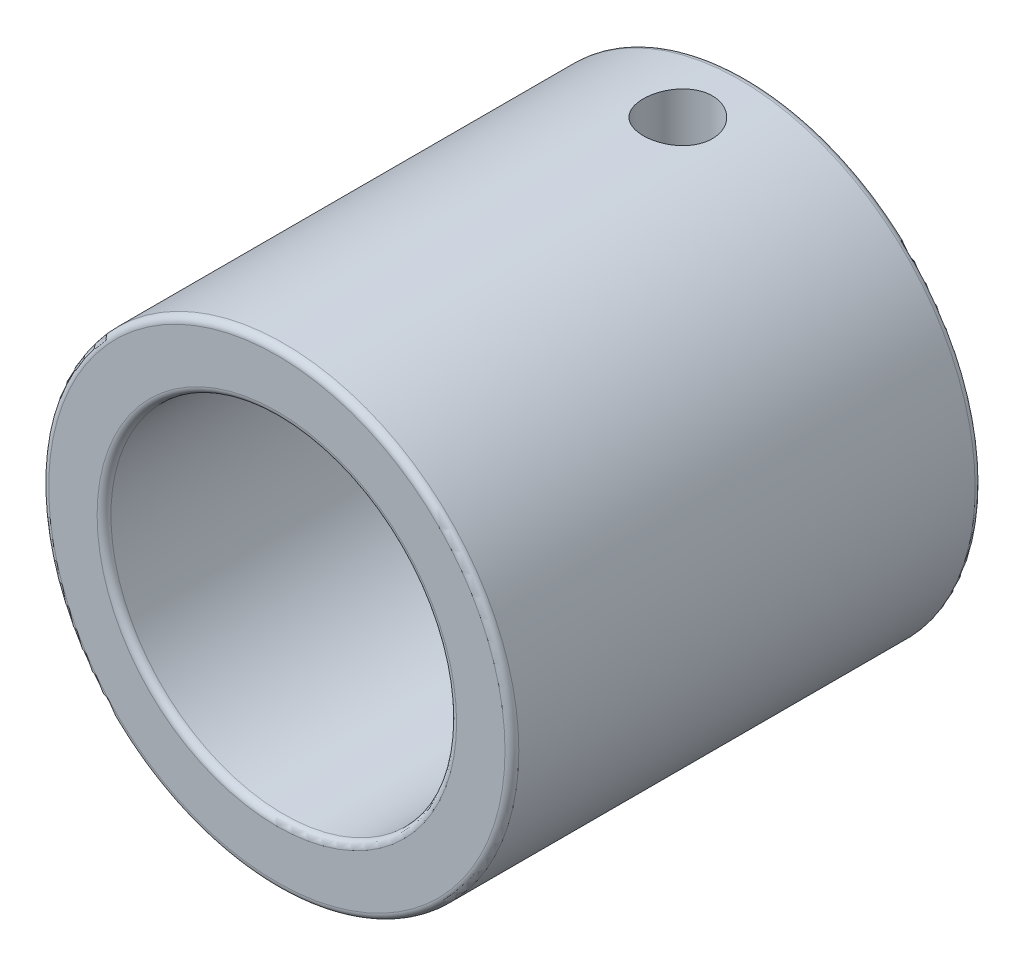
ISO-10303-21;
HEADER;
FILE_DESCRIPTION(('STEP AP214'),'2;1');
FILE_NAME('part.step','',(''),(''),'','','');
FILE_SCHEMA(('AUTOMOTIVE_DESIGN { 1 0 10303 214 1 1 1 1 }'));
ENDSEC;
DATA;
#1=APPLICATION_CONTEXT('core data for automotive mechanical design processes');
#2=APPLICATION_PROTOCOL_DEFINITION('international standard','automotive_design',2000,#1);
#3=PRODUCT_CONTEXT('',#1,'mechanical');
#4=PRODUCT('Part','Part','',(#3));
#5=PRODUCT_RELATED_PRODUCT_CATEGORY('part','',(#4));
#6=PRODUCT_DEFINITION_FORMATION('','',#4);
#7=PRODUCT_DEFINITION_CONTEXT('part definition',#1,'design');
#8=PRODUCT_DEFINITION('design','',#6,#7);
#9=PRODUCT_DEFINITION_SHAPE('','',#8);
#10=(LENGTH_UNIT() NAMED_UNIT(*) SI_UNIT(.MILLI.,.METRE.));
#11=(NAMED_UNIT(*) PLANE_ANGLE_UNIT() SI_UNIT($,.RADIAN.));
#12=(NAMED_UNIT(*) SI_UNIT($,.STERADIAN.) SOLID_ANGLE_UNIT());
#13=UNCERTAINTY_MEASURE_WITH_UNIT(LENGTH_MEASURE(1.E-05),#10,'distance_accuracy_value','');
#14=(GEOMETRIC_REPRESENTATION_CONTEXT(3) GLOBAL_UNCERTAINTY_ASSIGNED_CONTEXT((#13)) GLOBAL_UNIT_ASSIGNED_CONTEXT((#10,
#11,#12)) REPRESENTATION_CONTEXT('',''));
#15=CARTESIAN_POINT('',(0.,0.,0.));
#16=DIRECTION('',(0.,0.,1.));
#17=DIRECTION('',(1.,0.,0.));
#18=AXIS2_PLACEMENT_3D('',#15,#16,#17);
#19=CARTESIAN_POINT('',(0.,0.,34.));
#20=DIRECTION('',(0.,0.,1.));
#21=DIRECTION('',(1.,0.,0.));
#22=AXIS2_PLACEMENT_3D('',#19,#20,#21);
#23=PLANE('',#22);
#24=CARTESIAN_POINT('',(0.,0.,34.));
#25=DIRECTION('',(0.,0.,1.));
#26=DIRECTION('',(1.,0.,0.));
#27=AXIS2_PLACEMENT_3D('',#24,#25,#26);
#28=CIRCLE('',#27,13.);
#29=CARTESIAN_POINT('',(13.,0.,34.));
#30=VERTEX_POINT('',#29);
#31=EDGE_CURVE('E10',#30,#30,#28,.F.);
#32=ORIENTED_EDGE('',*,*,#31,.T.);
#33=EDGE_LOOP('',(#32));
#34=FACE_BOUND('',#33,.T.);
#35=CARTESIAN_POINT('',(0.,0.,34.));
#36=DIRECTION('',(0.,0.,1.));
#37=DIRECTION('',(1.,0.,0.));
#38=AXIS2_PLACEMENT_3D('',#35,#36,#37);
#39=CIRCLE('',#38,16.5);
#40=CARTESIAN_POINT('',(16.5,0.,34.));
#41=VERTEX_POINT('',#40);
#42=EDGE_CURVE('E43',#41,#41,#39,.T.);
#43=ORIENTED_EDGE('',*,*,#42,.T.);
#44=EDGE_LOOP('',(#43));
#45=FACE_BOUND('',#44,.T.);
#46=ADVANCED_FACE('F30',(#34,#45),#23,.T.);
#47=CARTESIAN_POINT('',(0.,0.,0.));
#48=DIRECTION('',(0.,0.,1.));
#49=DIRECTION('',(1.,0.,0.));
#50=AXIS2_PLACEMENT_3D('',#47,#48,#49);
#51=PLANE('',#50);
#52=CARTESIAN_POINT('',(0.,0.,0.));
#53=DIRECTION('',(0.,0.,1.));
#54=DIRECTION('',(1.,0.,0.));
#55=AXIS2_PLACEMENT_3D('',#52,#53,#54);
#56=CIRCLE('',#55,13.);
#57=CARTESIAN_POINT('',(13.,0.,0.));
#58=VERTEX_POINT('',#57);
#59=EDGE_CURVE('E116',#58,#58,#56,.T.);
#60=ORIENTED_EDGE('',*,*,#59,.T.);
#61=EDGE_LOOP('',(#60));
#62=FACE_BOUND('',#61,.T.);
#63=CARTESIAN_POINT('',(0.,0.,0.));
#64=DIRECTION('',(0.,0.,1.));
#65=DIRECTION('',(1.,0.,0.));
#66=AXIS2_PLACEMENT_3D('',#63,#64,#65);
#67=CIRCLE('',#66,16.5);
#68=CARTESIAN_POINT('',(16.5,0.,0.));
#69=VERTEX_POINT('',#68);
#70=EDGE_CURVE('E119',#69,#69,#67,.F.);
#71=ORIENTED_EDGE('',*,*,#70,.T.);
#72=EDGE_LOOP('',(#71));
#73=FACE_BOUND('',#72,.T.);
#74=ADVANCED_FACE('F85',(#62,#73),#51,.F.);
#75=CARTESIAN_POINT('',(0.,0.,34.));
#76=DIRECTION('',(0.,0.,-1.));
#77=DIRECTION('',(-1.,0.,0.));
#78=AXIS2_PLACEMENT_3D('',#75,#76,#77);
#79=CYLINDRICAL_SURFACE('',#78,17.);
#80=CARTESIAN_POINT('',(0.,-17.,7.5));
#81=CARTESIAN_POINT('',(0.139618263933644,-16.999997793131,7.4999942181081));
#82=CARTESIAN_POINT('',(0.279318334742722,-16.9982619631343,7.48826456512113));
#83=CARTESIAN_POINT('',(0.554815864347195,-16.9915044414465,7.44166648859107));
#84=CARTESIAN_POINT('',(0.690609351356019,-16.9864795210156,7.40677532804721));
#85=CARTESIAN_POINT('',(0.954266664820791,-16.9737086836159,7.31491747338719));
#86=CARTESIAN_POINT('',(1.08213631987448,-16.9659647952965,7.25796723451278));
#87=CARTESIAN_POINT('',(1.3264840365203,-16.9486124241397,7.12364753379347));
#88=CARTESIAN_POINT('',(1.44296372374599,-16.9390042079744,7.04628099171319));
#89=CARTESIAN_POINT('',(1.66212119979329,-16.9189113868222,6.87270465235347));
#90=CARTESIAN_POINT('',(1.76470092382526,-16.9084213236713,6.77637165727851));
#91=CARTESIAN_POINT('',(1.95230070871523,-16.887789985922,6.56786201635141));
#92=CARTESIAN_POINT('',(2.03731977497713,-16.8776487311065,6.45568447370532));
#93=CARTESIAN_POINT('',(2.18776463859896,-16.8588102121396,6.21801373636616));
#94=CARTESIAN_POINT('',(2.25309591742832,-16.8501200004422,6.09246010427652));
#95=CARTESIAN_POINT('',(2.36170671911329,-16.8352417558288,5.83201297323057));
#96=CARTESIAN_POINT('',(2.40498739680279,-16.8290535918791,5.69711996381641));
#97=CARTESIAN_POINT('',(2.46796464304165,-16.819933589302,5.42285300628695));
#98=CARTESIAN_POINT('',(2.48782883746781,-16.8169786171038,5.28351833167848));
#99=CARTESIAN_POINT('',(2.50392846030982,-16.8145892786749,5.00346438611802));
#100=CARTESIAN_POINT('',(2.50016519348747,-16.8151547180392,4.86274519205078));
#101=CARTESIAN_POINT('',(2.46925378270774,-16.8197211578168,4.58509880515093));
#102=CARTESIAN_POINT('',(2.44229207080977,-16.8236947679923,4.44815034087365));
#103=CARTESIAN_POINT('',(2.36604083270518,-16.8345870467401,4.18074255570013));
#104=CARTESIAN_POINT('',(2.31675069735604,-16.8415057956586,4.05028341194704));
#105=CARTESIAN_POINT('',(2.19704705914093,-16.857539142223,3.79898878161492));
#106=CARTESIAN_POINT('',(2.12655433007144,-16.8666619500121,3.67819157954196));
#107=CARTESIAN_POINT('',(1.96650298810832,-16.8860695216999,3.45006995910381));
#108=CARTESIAN_POINT('',(1.87694317178514,-16.8963543589216,3.34274639181437));
#109=CARTESIAN_POINT('',(1.6802753243751,-16.9170482652418,3.14353786371119));
#110=CARTESIAN_POINT('',(1.57300695254414,-16.9274575785055,3.05181115009009));
#111=CARTESIAN_POINT('',(1.34451413749425,-16.9471357134677,2.88763830975104));
#112=CARTESIAN_POINT('',(1.22328963737823,-16.9564045305161,2.81519226164154));
#113=CARTESIAN_POINT('',(0.9701904368467,-16.9727664753804,2.69163011353676));
#114=CARTESIAN_POINT('',(0.838309834869857,-16.9798583870044,2.64052593107167));
#115=CARTESIAN_POINT('',(0.567710944898676,-16.991057196357,2.56123422839847));
#116=CARTESIAN_POINT('',(0.428993101669628,-16.9951642879764,2.53304521963036));
#117=CARTESIAN_POINT('',(0.15002351928223,-16.9999050818336,2.50059379681278));
#118=CARTESIAN_POINT('',(0.00979761097236529,-17.0005703732726,2.4961137704723));
#119=CARTESIAN_POINT('',(-0.269403415413676,-16.9984385067869,2.51063029513393));
#120=CARTESIAN_POINT('',(-0.408378570541142,-16.9956414517703,2.52962614838472));
#121=CARTESIAN_POINT('',(-0.680476104424864,-16.9869187192332,2.59037427213087));
#122=CARTESIAN_POINT('',(-0.81362259518972,-16.9810075822558,2.63202080910918));
#123=CARTESIAN_POINT('',(-1.07104301967474,-16.9667174597167,2.73677680702144));
#124=CARTESIAN_POINT('',(-1.19531655049811,-16.9583383621802,2.7998872418232));
#125=CARTESIAN_POINT('',(-1.43242218615397,-16.9399652839742,2.94629211293999));
#126=CARTESIAN_POINT('',(-1.54516798121673,-16.9299603948874,3.02972493574426));
#127=CARTESIAN_POINT('',(-1.75513489222198,-16.9094840590999,3.21421317128844));
#128=CARTESIAN_POINT('',(-1.85235514217674,-16.8990125864157,3.31526956638309));
#129=CARTESIAN_POINT('',(-2.02930056628108,-16.8786834541762,3.53310384208332));
#130=CARTESIAN_POINT('',(-2.10888006584902,-16.8688313544641,3.65000065064076));
#131=CARTESIAN_POINT('',(-2.24727323997786,-16.8509540599789,3.89563010732929));
#132=CARTESIAN_POINT('',(-2.3060874583028,-16.8429288173692,4.02436244542143));
#133=CARTESIAN_POINT('',(-2.40105348668989,-16.8296538581595,4.28956983118956));
#134=CARTESIAN_POINT('',(-2.43728264767767,-16.8243946779348,4.42601668637408));
#135=CARTESIAN_POINT('',(-2.48629673443479,-16.8172219020188,4.70314115317623));
#136=CARTESIAN_POINT('',(-2.4990832109862,-16.815308085025,4.84381848431332));
#137=CARTESIAN_POINT('',(-2.50081314025998,-16.8150507670265,5.12395898989844));
#138=CARTESIAN_POINT('',(-2.48998561242761,-16.8166729719777,5.26342077278041));
#139=CARTESIAN_POINT('',(-2.4452849279886,-16.8232304869987,5.53851731267613));
#140=CARTESIAN_POINT('',(-2.41141180268506,-16.8281657925681,5.67415207488791));
#141=CARTESIAN_POINT('',(-2.32166128628094,-16.8407816094163,5.93768511955507));
#142=CARTESIAN_POINT('',(-2.265799280287,-16.8484602009356,6.06558873928598));
#143=CARTESIAN_POINT('',(-2.13367943489691,-16.8656998369544,6.31024522687879));
#144=CARTESIAN_POINT('',(-2.05742095912403,-16.8752609401864,6.42699774666834));
#145=CARTESIAN_POINT('',(-1.88583847980749,-16.8952988011725,6.64720241778312));
#146=CARTESIAN_POINT('',(-1.79034469442663,-16.9057832085905,6.75052159434606));
#147=CARTESIAN_POINT('',(-1.58336095356046,-16.92642201351,6.93975078053958));
#148=CARTESIAN_POINT('',(-1.47186727949618,-16.9365763336202,7.02565673188525));
#149=CARTESIAN_POINT('',(-1.23535773881122,-16.9554718925698,7.17802419179684));
#150=CARTESIAN_POINT('',(-1.11027358494527,-16.9642053874589,7.24438064153127));
#151=CARTESIAN_POINT('',(-0.850667584310128,-16.9791991247469,7.35504430031826));
#152=CARTESIAN_POINT('',(-0.716155741284792,-16.9854619433621,7.39937448911674));
#153=CARTESIAN_POINT('',(-0.484190218187672,-16.9933688461727,7.45459952939808));
#154=CARTESIAN_POINT('',(-0.388172624228649,-16.9958428419025,7.47159888675541));
#155=CARTESIAN_POINT('',(-0.194783283695076,-16.9991591791261,7.4943010729119));
#156=CARTESIAN_POINT('',(-0.0974115529944619,-17.0000015397308,7.50000403402144));
#157=CARTESIAN_POINT('',(0.,-17.,7.5));
#158=B_SPLINE_CURVE_WITH_KNOTS('',3,(#80,#81,#82,#83,#84,#85,#86,#87,#88,#89,#90,#91,#92,#93,
#94,#95,#96,#97,#98,#99,#100,#101,#102,#103,#104,#105,#106,#107,#108,#109,#110,#111,#112,#113,
#114,#115,#116,#117,#118,#119,#120,#121,#122,#123,#124,#125,#126,#127,#128,#129,#130,#131,#132,
#133,#134,#135,#136,#137,#138,#139,#140,#141,#142,#143,#144,#145,#146,#147,#148,#149,#150,#151,
#152,#153,#154,#155,#156,#157),.UNSPECIFIED.,.T.,.F.,(4,2,2,2,2,2,2,2,2,2,2,2,2,2,2,2,2,2,2,2,2,
2,2,2,2,2,2,2,2,2,2,2,2,2,2,2,2,2,4),(0.,0.418498857511903,0.83740915233018,1.25600755579684,
1.67454612732146,2.09589880308585,2.51727533677714,2.94064374704006,3.36398998237661,
3.78428694551126,4.20456069910212,4.62148817747431,5.03842703074503,5.45694360373012,
5.87548659945093,6.29805109091574,6.72061730517519,7.14341917050654,7.56619356861207,
7.98508072630458,8.40395543411032,8.82089140788565,9.23784630155638,9.65772400348285,
10.0776251172785,10.5008742387869,10.9241122761825,11.3458926970847,11.7676452153327,
12.1853255880243,12.6030053933771,13.0203934758991,13.4377945825891,13.8590554809119,
14.2804144447029,14.7039981269519,15.1271389563846,15.4191287002785,15.7111150241883),.UNSPECIFIED.);
#159=CARTESIAN_POINT('',(0.,-17.,7.5));
#160=VERTEX_POINT('',#159);
#161=EDGE_CURVE('E75',#160,#160,#158,.T.);
#162=ORIENTED_EDGE('',*,*,#161,.T.);
#163=EDGE_LOOP('',(#162));
#164=FACE_BOUND('',#163,.T.);
#165=CARTESIAN_POINT('',(0.,17.,7.5));
#166=CARTESIAN_POINT('',(-0.139618263933644,16.999997793131,7.4999942181081));
#167=CARTESIAN_POINT('',(-0.279318334742722,16.9982619631343,7.48826456512113));
#168=CARTESIAN_POINT('',(-0.554815864347195,16.9915044414465,7.44166648859107));
#169=CARTESIAN_POINT('',(-0.690609351356019,16.9864795210156,7.40677532804721));
#170=CARTESIAN_POINT('',(-0.954266664820791,16.9737086836159,7.31491747338719));
#171=CARTESIAN_POINT('',(-1.08213631987448,16.9659647952965,7.25796723451278));
#172=CARTESIAN_POINT('',(-1.3264840365203,16.9486124241397,7.12364753379347));
#173=CARTESIAN_POINT('',(-1.44296372374599,16.9390042079744,7.04628099171319));
#174=CARTESIAN_POINT('',(-1.66212119979329,16.9189113868222,6.87270465235347));
#175=CARTESIAN_POINT('',(-1.76470092382526,16.9084213236713,6.77637165727851));
#176=CARTESIAN_POINT('',(-1.95230070871523,16.887789985922,6.56786201635141));
#177=CARTESIAN_POINT('',(-2.03731977497713,16.8776487311065,6.45568447370532));
#178=CARTESIAN_POINT('',(-2.18776463859896,16.8588102121396,6.21801373636616));
#179=CARTESIAN_POINT('',(-2.25309591742832,16.8501200004422,6.09246010427652));
#180=CARTESIAN_POINT('',(-2.36170671911329,16.8352417558288,5.83201297323057));
#181=CARTESIAN_POINT('',(-2.40498739680279,16.8290535918791,5.69711996381641));
#182=CARTESIAN_POINT('',(-2.46796464304165,16.819933589302,5.42285300628695));
#183=CARTESIAN_POINT('',(-2.48782883746781,16.8169786171038,5.28351833167848));
#184=CARTESIAN_POINT('',(-2.50392846030982,16.8145892786749,5.00346438611802));
#185=CARTESIAN_POINT('',(-2.50016519348747,16.8151547180392,4.86274519205078));
#186=CARTESIAN_POINT('',(-2.46925378270774,16.8197211578168,4.58509880515093));
#187=CARTESIAN_POINT('',(-2.44229207080977,16.8236947679923,4.44815034087365));
#188=CARTESIAN_POINT('',(-2.36604083270518,16.8345870467401,4.18074255570013));
#189=CARTESIAN_POINT('',(-2.31675069735604,16.8415057956586,4.05028341194704));
#190=CARTESIAN_POINT('',(-2.19704705914093,16.857539142223,3.79898878161492));
#191=CARTESIAN_POINT('',(-2.12655433007144,16.8666619500121,3.67819157954196));
#192=CARTESIAN_POINT('',(-1.96650298810832,16.8860695216999,3.45006995910381));
#193=CARTESIAN_POINT('',(-1.87694317178514,16.8963543589216,3.34274639181437));
#194=CARTESIAN_POINT('',(-1.6802753243751,16.9170482652418,3.14353786371119));
#195=CARTESIAN_POINT('',(-1.57300695254414,16.9274575785055,3.05181115009009));
#196=CARTESIAN_POINT('',(-1.34451413749425,16.9471357134677,2.88763830975104));
#197=CARTESIAN_POINT('',(-1.22328963737823,16.9564045305161,2.81519226164154));
#198=CARTESIAN_POINT('',(-0.9701904368467,16.9727664753804,2.69163011353676));
#199=CARTESIAN_POINT('',(-0.838309834869857,16.9798583870044,2.64052593107167));
#200=CARTESIAN_POINT('',(-0.567710944898676,16.991057196357,2.56123422839847));
#201=CARTESIAN_POINT('',(-0.428993101669628,16.9951642879764,2.53304521963036));
#202=CARTESIAN_POINT('',(-0.15002351928223,16.9999050818336,2.50059379681278));
#203=CARTESIAN_POINT('',(-0.00979761097236529,17.0005703732726,2.4961137704723));
#204=CARTESIAN_POINT('',(0.269403415413676,16.9984385067869,2.51063029513393));
#205=CARTESIAN_POINT('',(0.408378570541142,16.9956414517703,2.52962614838472));
#206=CARTESIAN_POINT('',(0.680476104424864,16.9869187192332,2.59037427213087));
#207=CARTESIAN_POINT('',(0.81362259518972,16.9810075822558,2.63202080910918));
#208=CARTESIAN_POINT('',(1.07104301967474,16.9667174597167,2.73677680702144));
#209=CARTESIAN_POINT('',(1.19531655049811,16.9583383621802,2.7998872418232));
#210=CARTESIAN_POINT('',(1.43242218615397,16.9399652839742,2.94629211293999));
#211=CARTESIAN_POINT('',(1.54516798121673,16.9299603948874,3.02972493574426));
#212=CARTESIAN_POINT('',(1.75513489222198,16.9094840590999,3.21421317128844));
#213=CARTESIAN_POINT('',(1.85235514217674,16.8990125864157,3.31526956638309));
#214=CARTESIAN_POINT('',(2.02930056628108,16.8786834541762,3.53310384208332));
#215=CARTESIAN_POINT('',(2.10888006584902,16.8688313544641,3.65000065064076));
#216=CARTESIAN_POINT('',(2.24727323997786,16.8509540599789,3.89563010732929));
#217=CARTESIAN_POINT('',(2.3060874583028,16.8429288173692,4.02436244542143));
#218=CARTESIAN_POINT('',(2.40105348668989,16.8296538581595,4.28956983118956));
#219=CARTESIAN_POINT('',(2.43728264767767,16.8243946779348,4.42601668637408));
#220=CARTESIAN_POINT('',(2.48629673443479,16.8172219020188,4.70314115317623));
#221=CARTESIAN_POINT('',(2.4990832109862,16.815308085025,4.84381848431332));
#222=CARTESIAN_POINT('',(2.50081314025998,16.8150507670265,5.12395898989844));
#223=CARTESIAN_POINT('',(2.48998561242761,16.8166729719777,5.26342077278041));
#224=CARTESIAN_POINT('',(2.4452849279886,16.8232304869987,5.53851731267613));
#225=CARTESIAN_POINT('',(2.41141180268506,16.8281657925681,5.67415207488791));
#226=CARTESIAN_POINT('',(2.32166128628094,16.8407816094163,5.93768511955507));
#227=CARTESIAN_POINT('',(2.265799280287,16.8484602009356,6.06558873928598));
#228=CARTESIAN_POINT('',(2.13367943489691,16.8656998369544,6.31024522687879));
#229=CARTESIAN_POINT('',(2.05742095912403,16.8752609401864,6.42699774666834));
#230=CARTESIAN_POINT('',(1.88583847980749,16.8952988011725,6.64720241778312));
#231=CARTESIAN_POINT('',(1.79034469442663,16.9057832085905,6.75052159434606));
#232=CARTESIAN_POINT('',(1.58336095356046,16.92642201351,6.93975078053958));
#233=CARTESIAN_POINT('',(1.47186727949618,16.9365763336202,7.02565673188525));
#234=CARTESIAN_POINT('',(1.23535773881122,16.9554718925698,7.17802419179684));
#235=CARTESIAN_POINT('',(1.11027358494527,16.9642053874589,7.24438064153127));
#236=CARTESIAN_POINT('',(0.850667584310128,16.9791991247469,7.35504430031826));
#237=CARTESIAN_POINT('',(0.716155741284792,16.9854619433621,7.39937448911674));
#238=CARTESIAN_POINT('',(0.484190218187672,16.9933688461727,7.45459952939808));
#239=CARTESIAN_POINT('',(0.388172624228649,16.9958428419025,7.47159888675541));
#240=CARTESIAN_POINT('',(0.194783283695076,16.9991591791261,7.4943010729119));
#241=CARTESIAN_POINT('',(0.0974115529944619,17.0000015397308,7.50000403402144));
#242=CARTESIAN_POINT('',(0.,17.,7.5));
#243=B_SPLINE_CURVE_WITH_KNOTS('',3,(#165,#166,#167,#168,#169,#170,#171,#172,#173,#174,#175,
#176,#177,#178,#179,#180,#181,#182,#183,#184,#185,#186,#187,#188,#189,#190,#191,#192,#193,#194,
#195,#196,#197,#198,#199,#200,#201,#202,#203,#204,#205,#206,#207,#208,#209,#210,#211,#212,#213,
#214,#215,#216,#217,#218,#219,#220,#221,#222,#223,#224,#225,#226,#227,#228,#229,#230,#231,#232,
#233,#234,#235,#236,#237,#238,#239,#240,#241,#242),.UNSPECIFIED.,.T.,.F.,(4,2,2,2,2,2,2,2,2,2,2,
2,2,2,2,2,2,2,2,2,2,2,2,2,2,2,2,2,2,2,2,2,2,2,2,2,2,2,4),(0.,0.418498857511903,0.83740915233018,
1.25600755579684,1.67454612732146,2.09589880308585,2.51727533677714,2.94064374704006,
3.36398998237661,3.78428694551126,4.20456069910212,4.62148817747431,5.03842703074503,
5.45694360373012,5.87548659945093,6.29805109091574,6.72061730517519,7.14341917050654,
7.56619356861207,7.98508072630458,8.40395543411032,8.82089140788565,9.23784630155638,
9.65772400348285,10.0776251172785,10.5008742387869,10.9241122761825,11.3458926970847,
11.7676452153327,12.1853255880243,12.6030053933771,13.0203934758991,13.4377945825891,
13.8590554809119,14.2804144447029,14.7039981269519,15.1271389563846,15.4191287002785,
15.7111150241883),.UNSPECIFIED.);
#244=CARTESIAN_POINT('',(0.,17.,7.5));
#245=VERTEX_POINT('',#244);
#246=EDGE_CURVE('E69',#245,#245,#243,.T.);
#247=ORIENTED_EDGE('',*,*,#246,.T.);
#248=EDGE_LOOP('',(#247));
#249=FACE_BOUND('',#248,.T.);
#250=CARTESIAN_POINT('',(0.,0.,0.5));
#251=DIRECTION('',(0.,0.,1.));
#252=DIRECTION('',(1.,0.,0.));
#253=AXIS2_PLACEMENT_3D('',#250,#251,#252);
#254=CIRCLE('',#253,17.);
#255=CARTESIAN_POINT('',(17.,0.,0.5));
#256=VERTEX_POINT('',#255);
#257=EDGE_CURVE('E48',#256,#256,#254,.T.);
#258=ORIENTED_EDGE('',*,*,#257,.T.);
#259=EDGE_LOOP('',(#258));
#260=FACE_BOUND('',#259,.T.);
#261=CARTESIAN_POINT('',(0.,0.,33.5));
#262=DIRECTION('',(0.,0.,1.));
#263=DIRECTION('',(1.,0.,0.));
#264=AXIS2_PLACEMENT_3D('',#261,#262,#263);
#265=CIRCLE('',#264,17.);
#266=CARTESIAN_POINT('',(17.,0.,33.5));
#267=VERTEX_POINT('',#266);
#268=EDGE_CURVE('E129',#267,#267,#265,.F.);
#269=ORIENTED_EDGE('',*,*,#268,.T.);
#270=EDGE_LOOP('',(#269));
#271=FACE_BOUND('',#270,.T.);
#272=ADVANCED_FACE('F80',(#164,#249,#260,#271),#79,.T.);
#273=CARTESIAN_POINT('',(0.,0.,34.));
#274=DIRECTION('',(0.,0.,-1.));
#275=DIRECTION('',(-1.,0.,0.));
#276=AXIS2_PLACEMENT_3D('',#273,#274,#275);
#277=CYLINDRICAL_SURFACE('',#276,12.5);
#278=CARTESIAN_POINT('',(0.,-12.5,7.5));
#279=CARTESIAN_POINT('',(0.138942266981583,-12.4999974395218,7.49999488875414));
#280=CARTESIAN_POINT('',(0.277949150503806,-12.4976596294558,7.48837789258089));
#281=CARTESIAN_POINT('',(0.552033769222549,-12.4885591405808,7.44225374971189));
#282=CARTESIAN_POINT('',(0.68710829385339,-12.4817929465047,7.40772841799623));
#283=CARTESIAN_POINT('',(0.949325763158283,-12.4645912319572,7.31689681594803));
#284=CARTESIAN_POINT('',(1.07647616983284,-12.454159226918,7.26061140788828));
#285=CARTESIAN_POINT('',(1.31951997216056,-12.4307599508829,7.12791938122176));
#286=CARTESIAN_POINT('',(1.43541403768953,-12.4177928308927,7.05151396098199));
#287=CARTESIAN_POINT('',(1.65423369328716,-12.3905541332492,6.87965376427141));
#288=CARTESIAN_POINT('',(1.75698487789631,-12.3762686376087,6.78397911152199));
#289=CARTESIAN_POINT('',(1.94509189152007,-12.3481045113147,6.57676895902074));
#290=CARTESIAN_POINT('',(2.03044636192606,-12.3342259125106,6.4652322216622));
#291=CARTESIAN_POINT('',(2.18207938336905,-12.3083110453154,6.22820951747031));
#292=CARTESIAN_POINT('',(2.24817734716467,-12.2962926841237,6.1026058905091));
#293=CARTESIAN_POINT('',(2.35826416645077,-12.2756567014604,5.8417954524898));
#294=CARTESIAN_POINT('',(2.4022552060931,-12.267038744049,5.70658959163414));
#295=CARTESIAN_POINT('',(2.46631324971207,-12.2543201313051,5.43228909023021));
#296=CARTESIAN_POINT('',(2.48668624489694,-12.2501617526797,5.29326863964443));
#297=CARTESIAN_POINT('',(2.5038803193153,-12.2466593765157,5.01372544658914));
#298=CARTESIAN_POINT('',(2.50070380678375,-12.247314886696,4.87320285919964));
#299=CARTESIAN_POINT('',(2.47113643275455,-12.2533137787046,4.59688302994749));
#300=CARTESIAN_POINT('',(2.44509635060976,-12.2585863214691,4.46104648593172));
#301=CARTESIAN_POINT('',(2.37109471155763,-12.273113654,4.1957098083425));
#302=CARTESIAN_POINT('',(2.3231321077517,-12.2823686339445,4.06620997770248));
#303=CARTESIAN_POINT('',(2.2063119591868,-12.3038904625102,3.816211845741));
#304=CARTESIAN_POINT('',(2.13731537808029,-12.3161772453426,3.69578030107707));
#305=CARTESIAN_POINT('',(1.9804839364317,-12.3423654693265,3.46807287506797));
#306=CARTESIAN_POINT('',(1.89264691089207,-12.3562670959591,3.36079850787211));
#307=CARTESIAN_POINT('',(1.69874983640146,-12.3844255310365,3.16042649385766));
#308=CARTESIAN_POINT('',(1.59239040303111,-12.3986842302726,3.06761858035217));
#309=CARTESIAN_POINT('',(1.36546256015503,-12.4257212178602,2.90111538424694));
#310=CARTESIAN_POINT('',(1.24489396844847,-12.4384994872243,2.82742034676605));
#311=CARTESIAN_POINT('',(0.992648467197303,-12.4611672540222,2.70118122693506));
#312=CARTESIAN_POINT('',(0.860954548963251,-12.4710522212068,2.64867026588866));
#313=CARTESIAN_POINT('',(0.590372441121663,-12.4867852246965,2.56659881490358));
#314=CARTESIAN_POINT('',(0.451485125181125,-12.4926337500133,2.53703554481593));
#315=CARTESIAN_POINT('',(0.172948514067877,-12.4995667966717,2.50210886551431));
#316=CARTESIAN_POINT('',(0.0333508208139411,-12.5007293663117,2.49634895114933));
#317=CARTESIAN_POINT('',(-0.244812335481785,-12.4983762982526,2.50812464735545));
#318=CARTESIAN_POINT('',(-0.383377856109483,-12.4948609235362,2.52565894838149));
#319=CARTESIAN_POINT('',(-0.654264149866352,-12.4835958002004,2.58319593385989));
#320=CARTESIAN_POINT('',(-0.786629870849757,-12.4758844101052,2.62299517124476));
#321=CARTESIAN_POINT('',(-1.04280906874917,-12.4570888015258,2.72370995663952));
#322=CARTESIAN_POINT('',(-1.16662190409385,-12.4460043303557,2.78462708669207));
#323=CARTESIAN_POINT('',(-1.40385293421554,-12.4214977883324,2.92670622662828));
#324=CARTESIAN_POINT('',(-1.51712531688047,-12.4080487609263,3.00810695259736));
#325=CARTESIAN_POINT('',(-1.72854504779802,-12.3803683707471,3.1885229780182));
#326=CARTESIAN_POINT('',(-1.82669077232691,-12.3661369242097,3.28754016599967));
#327=CARTESIAN_POINT('',(-2.00660147693544,-12.3382325889241,3.50218337972781));
#328=CARTESIAN_POINT('',(-2.08809425612164,-12.3245715058326,3.61803936055334));
#329=CARTESIAN_POINT('',(-2.23046355012801,-12.2996047949049,3.8620284033917));
#330=CARTESIAN_POINT('',(-2.29134088980726,-12.2882990728336,3.99016097393388));
#331=CARTESIAN_POINT('',(-2.3903796039549,-12.2694185146096,4.25442061537387));
#332=CARTESIAN_POINT('',(-2.42865874947763,-12.2618243718047,4.3905021030258));
#333=CARTESIAN_POINT('',(-2.48177162906799,-12.2511859198006,4.66733363372726));
#334=CARTESIAN_POINT('',(-2.49660842056278,-12.2481410172778,4.80808306552337));
#335=CARTESIAN_POINT('',(-2.50230227716867,-12.2469787407845,5.08752216136079));
#336=CARTESIAN_POINT('',(-2.49358947017724,-12.2487729797325,5.22620287231752));
#337=CARTESIAN_POINT('',(-2.45338076025015,-12.2568893371153,5.50007912476256));
#338=CARTESIAN_POINT('',(-2.42188504032325,-12.2632114191792,5.63527469423701));
#339=CARTESIAN_POINT('',(-2.33719642124739,-12.279631605479,5.89806927810136));
#340=CARTESIAN_POINT('',(-2.28405626679336,-12.2897205254708,6.02568590125604));
#341=CARTESIAN_POINT('',(-2.15763661150401,-12.3125428743543,6.2702593018361));
#342=CARTESIAN_POINT('',(-2.08435542193721,-12.3252765249723,6.38721518431284));
#343=CARTESIAN_POINT('',(-1.91826478696604,-12.3522240130806,6.60928893037579));
#344=CARTESIAN_POINT('',(-1.82514471808795,-12.3664593227425,6.71417191316899));
#345=CARTESIAN_POINT('',(-1.62266092253285,-12.3946520467989,6.90696551382293));
#346=CARTESIAN_POINT('',(-1.51329346788334,-12.4086093965796,6.99487222579318));
#347=CARTESIAN_POINT('',(-1.28004407272062,-12.4348458096993,7.15208660986612));
#348=CARTESIAN_POINT('',(-1.15602221107459,-12.4471057804812,7.22119000820006));
#349=CARTESIAN_POINT('',(-0.897915902351833,-12.468378127125,7.33746530649148));
#350=CARTESIAN_POINT('',(-0.763840652157817,-12.4773934284654,7.38465697383123));
#351=CARTESIAN_POINT('',(-0.524553722309451,-12.4894093148843,7.44662987011179));
#352=CARTESIAN_POINT('',(-0.420704160034463,-12.4933575789613,7.46660798426939));
#353=CARTESIAN_POINT('',(-0.211248813025168,-12.4986538534973,7.49329478089591));
#354=CARTESIAN_POINT('',(-0.105643084371548,-12.5000019468289,7.50000388627442));
#355=CARTESIAN_POINT('',(0.,-12.5,7.5));
#356=B_SPLINE_CURVE_WITH_KNOTS('',3,(#278,#279,#280,#281,#282,#283,#284,#285,#286,#287,#288,
#289,#290,#291,#292,#293,#294,#295,#296,#297,#298,#299,#300,#301,#302,#303,#304,#305,#306,#307,
#308,#309,#310,#311,#312,#313,#314,#315,#316,#317,#318,#319,#320,#321,#322,#323,#324,#325,#326,
#327,#328,#329,#330,#331,#332,#333,#334,#335,#336,#337,#338,#339,#340,#341,#342,#343,#344,#345,
#346,#347,#348,#349,#350,#351,#352,#353,#354,#355),.UNSPECIFIED.,.T.,.F.,(4,2,2,2,2,2,2,2,2,2,2,
2,2,2,2,2,2,2,2,2,2,2,2,2,2,2,2,2,2,2,2,2,2,2,2,2,2,2,4),(0.,0.416440326653146,
0.833211626728308,1.24958433812585,1.66593225557716,2.08733167528047,2.50876399186842,
2.93402987514807,3.35925373412994,3.77890462758968,4.19851260703063,4.61179317515696,
5.02509348134324,5.44118725508982,5.85732886874176,6.28095631228377,6.70458918849551,
7.1288818713506,7.5531231424509,7.97026839190663,8.38739019144669,8.80076134876809,
9.21416348040056,9.63262665083397,10.0511347086483,10.4760157144806,10.9008797180867,
11.3235095258181,11.7460842082604,12.1609930641925,12.5758985873152,12.9897990313278,
13.4037341895467,13.8247019059786,14.2457663633233,14.6712374168909,15.096323887938,
15.4129693822474,15.7296047842749),.UNSPECIFIED.);
#357=CARTESIAN_POINT('',(0.,-12.5,7.5));
#358=VERTEX_POINT('',#357);
#359=EDGE_CURVE('E34',#358,#358,#356,.T.);
#360=ORIENTED_EDGE('',*,*,#359,.F.);
#361=EDGE_LOOP('',(#360));
#362=FACE_BOUND('',#361,.T.);
#363=CARTESIAN_POINT('',(0.,12.5,7.5));
#364=CARTESIAN_POINT('',(-0.138942266981583,12.4999974395218,7.49999488875414));
#365=CARTESIAN_POINT('',(-0.277949150503806,12.4976596294558,7.48837789258089));
#366=CARTESIAN_POINT('',(-0.552033769222549,12.4885591405808,7.44225374971189));
#367=CARTESIAN_POINT('',(-0.68710829385339,12.4817929465047,7.40772841799623));
#368=CARTESIAN_POINT('',(-0.949325763158283,12.4645912319572,7.31689681594803));
#369=CARTESIAN_POINT('',(-1.07647616983284,12.454159226918,7.26061140788828));
#370=CARTESIAN_POINT('',(-1.31951997216056,12.4307599508829,7.12791938122176));
#371=CARTESIAN_POINT('',(-1.43541403768953,12.4177928308927,7.05151396098199));
#372=CARTESIAN_POINT('',(-1.65423369328716,12.3905541332492,6.87965376427141));
#373=CARTESIAN_POINT('',(-1.75698487789631,12.3762686376087,6.78397911152199));
#374=CARTESIAN_POINT('',(-1.94509189152007,12.3481045113147,6.57676895902074));
#375=CARTESIAN_POINT('',(-2.03044636192606,12.3342259125106,6.4652322216622));
#376=CARTESIAN_POINT('',(-2.18207938336905,12.3083110453154,6.22820951747031));
#377=CARTESIAN_POINT('',(-2.24817734716467,12.2962926841237,6.1026058905091));
#378=CARTESIAN_POINT('',(-2.35826416645077,12.2756567014604,5.8417954524898));
#379=CARTESIAN_POINT('',(-2.4022552060931,12.267038744049,5.70658959163414));
#380=CARTESIAN_POINT('',(-2.46631324971207,12.2543201313051,5.43228909023021));
#381=CARTESIAN_POINT('',(-2.48668624489694,12.2501617526797,5.29326863964443));
#382=CARTESIAN_POINT('',(-2.5038803193153,12.2466593765157,5.01372544658914));
#383=CARTESIAN_POINT('',(-2.50070380678375,12.247314886696,4.87320285919964));
#384=CARTESIAN_POINT('',(-2.47113643275455,12.2533137787046,4.59688302994749));
#385=CARTESIAN_POINT('',(-2.44509635060976,12.2585863214691,4.46104648593172));
#386=CARTESIAN_POINT('',(-2.37109471155763,12.273113654,4.1957098083425));
#387=CARTESIAN_POINT('',(-2.3231321077517,12.2823686339445,4.06620997770248));
#388=CARTESIAN_POINT('',(-2.2063119591868,12.3038904625102,3.816211845741));
#389=CARTESIAN_POINT('',(-2.13731537808029,12.3161772453426,3.69578030107707));
#390=CARTESIAN_POINT('',(-1.9804839364317,12.3423654693265,3.46807287506797));
#391=CARTESIAN_POINT('',(-1.89264691089207,12.3562670959591,3.36079850787211));
#392=CARTESIAN_POINT('',(-1.69874983640146,12.3844255310365,3.16042649385766));
#393=CARTESIAN_POINT('',(-1.59239040303111,12.3986842302726,3.06761858035217));
#394=CARTESIAN_POINT('',(-1.36546256015503,12.4257212178602,2.90111538424694));
#395=CARTESIAN_POINT('',(-1.24489396844847,12.4384994872243,2.82742034676605));
#396=CARTESIAN_POINT('',(-0.992648467197303,12.4611672540222,2.70118122693506));
#397=CARTESIAN_POINT('',(-0.860954548963251,12.4710522212068,2.64867026588866));
#398=CARTESIAN_POINT('',(-0.590372441121663,12.4867852246965,2.56659881490358));
#399=CARTESIAN_POINT('',(-0.451485125181125,12.4926337500133,2.53703554481593));
#400=CARTESIAN_POINT('',(-0.172948514067877,12.4995667966717,2.50210886551431));
#401=CARTESIAN_POINT('',(-0.0333508208139411,12.5007293663117,2.49634895114933));
#402=CARTESIAN_POINT('',(0.244812335481785,12.4983762982526,2.50812464735545));
#403=CARTESIAN_POINT('',(0.383377856109483,12.4948609235362,2.52565894838149));
#404=CARTESIAN_POINT('',(0.654264149866352,12.4835958002004,2.58319593385989));
#405=CARTESIAN_POINT('',(0.786629870849757,12.4758844101052,2.62299517124476));
#406=CARTESIAN_POINT('',(1.04280906874917,12.4570888015258,2.72370995663952));
#407=CARTESIAN_POINT('',(1.16662190409385,12.4460043303557,2.78462708669207));
#408=CARTESIAN_POINT('',(1.40385293421554,12.4214977883324,2.92670622662828));
#409=CARTESIAN_POINT('',(1.51712531688047,12.4080487609263,3.00810695259736));
#410=CARTESIAN_POINT('',(1.72854504779802,12.3803683707471,3.1885229780182));
#411=CARTESIAN_POINT('',(1.82669077232691,12.3661369242097,3.28754016599967));
#412=CARTESIAN_POINT('',(2.00660147693544,12.3382325889241,3.50218337972781));
#413=CARTESIAN_POINT('',(2.08809425612164,12.3245715058326,3.61803936055334));
#414=CARTESIAN_POINT('',(2.23046355012801,12.2996047949049,3.8620284033917));
#415=CARTESIAN_POINT('',(2.29134088980726,12.2882990728336,3.99016097393388));
#416=CARTESIAN_POINT('',(2.3903796039549,12.2694185146096,4.25442061537387));
#417=CARTESIAN_POINT('',(2.42865874947763,12.2618243718047,4.3905021030258));
#418=CARTESIAN_POINT('',(2.48177162906799,12.2511859198006,4.66733363372726));
#419=CARTESIAN_POINT('',(2.49660842056278,12.2481410172778,4.80808306552337));
#420=CARTESIAN_POINT('',(2.50230227716867,12.2469787407845,5.08752216136079));
#421=CARTESIAN_POINT('',(2.49358947017724,12.2487729797325,5.22620287231752));
#422=CARTESIAN_POINT('',(2.45338076025015,12.2568893371153,5.50007912476256));
#423=CARTESIAN_POINT('',(2.42188504032325,12.2632114191792,5.63527469423701));
#424=CARTESIAN_POINT('',(2.33719642124739,12.279631605479,5.89806927810136));
#425=CARTESIAN_POINT('',(2.28405626679336,12.2897205254708,6.02568590125604));
#426=CARTESIAN_POINT('',(2.15763661150401,12.3125428743543,6.2702593018361));
#427=CARTESIAN_POINT('',(2.08435542193721,12.3252765249723,6.38721518431284));
#428=CARTESIAN_POINT('',(1.91826478696604,12.3522240130806,6.60928893037579));
#429=CARTESIAN_POINT('',(1.82514471808795,12.3664593227425,6.71417191316899));
#430=CARTESIAN_POINT('',(1.62266092253285,12.3946520467989,6.90696551382293));
#431=CARTESIAN_POINT('',(1.51329346788334,12.4086093965796,6.99487222579318));
#432=CARTESIAN_POINT('',(1.28004407272062,12.4348458096993,7.15208660986612));
#433=CARTESIAN_POINT('',(1.15602221107459,12.4471057804812,7.22119000820006));
#434=CARTESIAN_POINT('',(0.897915902351833,12.468378127125,7.33746530649148));
#435=CARTESIAN_POINT('',(0.763840652157817,12.4773934284654,7.38465697383123));
#436=CARTESIAN_POINT('',(0.524553722309451,12.4894093148843,7.44662987011179));
#437=CARTESIAN_POINT('',(0.420704160034463,12.4933575789613,7.46660798426939));
#438=CARTESIAN_POINT('',(0.211248813025168,12.4986538534973,7.49329478089591));
#439=CARTESIAN_POINT('',(0.105643084371548,12.5000019468289,7.50000388627442));
#440=CARTESIAN_POINT('',(0.,12.5,7.5));
#441=B_SPLINE_CURVE_WITH_KNOTS('',3,(#363,#364,#365,#366,#367,#368,#369,#370,#371,#372,#373,
#374,#375,#376,#377,#378,#379,#380,#381,#382,#383,#384,#385,#386,#387,#388,#389,#390,#391,#392,
#393,#394,#395,#396,#397,#398,#399,#400,#401,#402,#403,#404,#405,#406,#407,#408,#409,#410,#411,
#412,#413,#414,#415,#416,#417,#418,#419,#420,#421,#422,#423,#424,#425,#426,#427,#428,#429,#430,
#431,#432,#433,#434,#435,#436,#437,#438,#439,#440),.UNSPECIFIED.,.T.,.F.,(4,2,2,2,2,2,2,2,2,2,2,
2,2,2,2,2,2,2,2,2,2,2,2,2,2,2,2,2,2,2,2,2,2,2,2,2,2,2,4),(0.,0.416440326653146,
0.833211626728308,1.24958433812585,1.66593225557716,2.08733167528047,2.50876399186842,
2.93402987514807,3.35925373412994,3.77890462758968,4.19851260703063,4.61179317515696,
5.02509348134324,5.44118725508982,5.85732886874176,6.28095631228377,6.70458918849551,
7.1288818713506,7.5531231424509,7.97026839190663,8.38739019144669,8.80076134876809,
9.21416348040056,9.63262665083397,10.0511347086483,10.4760157144806,10.9008797180867,
11.3235095258181,11.7460842082604,12.1609930641925,12.5758985873152,12.9897990313278,
13.4037341895467,13.8247019059786,14.2457663633233,14.6712374168909,15.096323887938,
15.4129693822474,15.7296047842749),.UNSPECIFIED.);
#442=CARTESIAN_POINT('',(0.,12.5,7.5));
#443=VERTEX_POINT('',#442);
#444=EDGE_CURVE('E51',#443,#443,#441,.T.);
#445=ORIENTED_EDGE('',*,*,#444,.F.);
#446=EDGE_LOOP('',(#445));
#447=FACE_BOUND('',#446,.T.);
#448=CARTESIAN_POINT('',(0.,0.,0.5));
#449=DIRECTION('',(0.,0.,1.));
#450=DIRECTION('',(1.,0.,0.));
#451=AXIS2_PLACEMENT_3D('',#448,#449,#450);
#452=CIRCLE('',#451,12.5);
#453=CARTESIAN_POINT('',(12.5,0.,0.5));
#454=VERTEX_POINT('',#453);
#455=EDGE_CURVE('E126',#454,#454,#452,.F.);
#456=ORIENTED_EDGE('',*,*,#455,.T.);
#457=EDGE_LOOP('',(#456));
#458=FACE_BOUND('',#457,.T.);
#459=CARTESIAN_POINT('',(0.,0.,33.5));
#460=DIRECTION('',(0.,0.,1.));
#461=DIRECTION('',(1.,0.,0.));
#462=AXIS2_PLACEMENT_3D('',#459,#460,#461);
#463=CIRCLE('',#462,12.5);
#464=CARTESIAN_POINT('',(12.5,0.,33.5));
#465=VERTEX_POINT('',#464);
#466=EDGE_CURVE('E120',#465,#465,#463,.T.);
#467=ORIENTED_EDGE('',*,*,#466,.T.);
#468=EDGE_LOOP('',(#467));
#469=FACE_BOUND('',#468,.T.);
#470=ADVANCED_FACE('F56',(#362,#447,#458,#469),#277,.F.);
#471=CARTESIAN_POINT('',(0.,0.,0.5));
#472=DIRECTION('',(0.,0.,1.));
#473=DIRECTION('',(1.,0.,0.));
#474=AXIS2_PLACEMENT_3D('',#471,#472,#473);
#475=TOROIDAL_SURFACE('',#474,13.,0.5);
#476=ORIENTED_EDGE('',*,*,#455,.F.);
#477=EDGE_LOOP('',(#476));
#478=FACE_BOUND('',#477,.T.);
#479=ORIENTED_EDGE('',*,*,#59,.F.);
#480=EDGE_LOOP('',(#479));
#481=FACE_BOUND('',#480,.T.);
#482=ADVANCED_FACE('F87',(#478,#481),#475,.T.);
#483=CARTESIAN_POINT('',(0.,0.,0.5));
#484=DIRECTION('',(0.,0.,1.));
#485=DIRECTION('',(1.,0.,0.));
#486=AXIS2_PLACEMENT_3D('',#483,#484,#485);
#487=TOROIDAL_SURFACE('',#486,16.5,0.5);
#488=ORIENTED_EDGE('',*,*,#70,.F.);
#489=EDGE_LOOP('',(#488));
#490=FACE_BOUND('',#489,.T.);
#491=ORIENTED_EDGE('',*,*,#257,.F.);
#492=EDGE_LOOP('',(#491));
#493=FACE_BOUND('',#492,.T.);
#494=ADVANCED_FACE('F91',(#490,#493),#487,.T.);
#495=CARTESIAN_POINT('',(0.,0.,33.5));
#496=DIRECTION('',(0.,0.,1.));
#497=DIRECTION('',(1.,0.,0.));
#498=AXIS2_PLACEMENT_3D('',#495,#496,#497);
#499=TOROIDAL_SURFACE('',#498,13.,0.5);
#500=ORIENTED_EDGE('',*,*,#31,.F.);
#501=EDGE_LOOP('',(#500));
#502=FACE_BOUND('',#501,.T.);
#503=ORIENTED_EDGE('',*,*,#466,.F.);
#504=EDGE_LOOP('',(#503));
#505=FACE_BOUND('',#504,.T.);
#506=ADVANCED_FACE('F94',(#502,#505),#499,.T.);
#507=CARTESIAN_POINT('',(0.,0.,33.5));
#508=DIRECTION('',(0.,0.,1.));
#509=DIRECTION('',(1.,0.,0.));
#510=AXIS2_PLACEMENT_3D('',#507,#508,#509);
#511=TOROIDAL_SURFACE('',#510,16.5,0.5);
#512=ORIENTED_EDGE('',*,*,#268,.F.);
#513=EDGE_LOOP('',(#512));
#514=FACE_BOUND('',#513,.T.);
#515=ORIENTED_EDGE('',*,*,#42,.F.);
#516=EDGE_LOOP('',(#515));
#517=FACE_BOUND('',#516,.T.);
#518=ADVANCED_FACE('F32',(#514,#517),#511,.T.);
#519=CARTESIAN_POINT('',(0.,-17.,5.));
#520=DIRECTION('',(0.,1.,0.));
#521=DIRECTION('',(0.,0.,1.));
#522=AXIS2_PLACEMENT_3D('',#519,#520,#521);
#523=CYLINDRICAL_SURFACE('',#522,2.5);
#524=ORIENTED_EDGE('',*,*,#444,.T.);
#525=EDGE_LOOP('',(#524));
#526=FACE_BOUND('',#525,.T.);
#527=ORIENTED_EDGE('',*,*,#246,.F.);
#528=EDGE_LOOP('',(#527));
#529=FACE_BOUND('',#528,.T.);
#530=ADVANCED_FACE('F62',(#526,#529),#523,.F.);
#531=ORIENTED_EDGE('',*,*,#359,.T.);
#532=EDGE_LOOP('',(#531));
#533=FACE_BOUND('',#532,.T.);
#534=ORIENTED_EDGE('',*,*,#161,.F.);
#535=EDGE_LOOP('',(#534));
#536=FACE_BOUND('',#535,.T.);
#537=ADVANCED_FACE('F59',(#533,#536),#523,.F.);
#538=CLOSED_SHELL('',(#46,#74,#272,#470,#482,#494,#506,#518,#530,#537));
#539=MANIFOLD_SOLID_BREP('B2',#538);
#540=ADVANCED_BREP_SHAPE_REPRESENTATION('',(#18,#539),#14);
#541=SHAPE_DEFINITION_REPRESENTATION(#9,#540);
ENDSEC;
END-ISO-10303-21;
